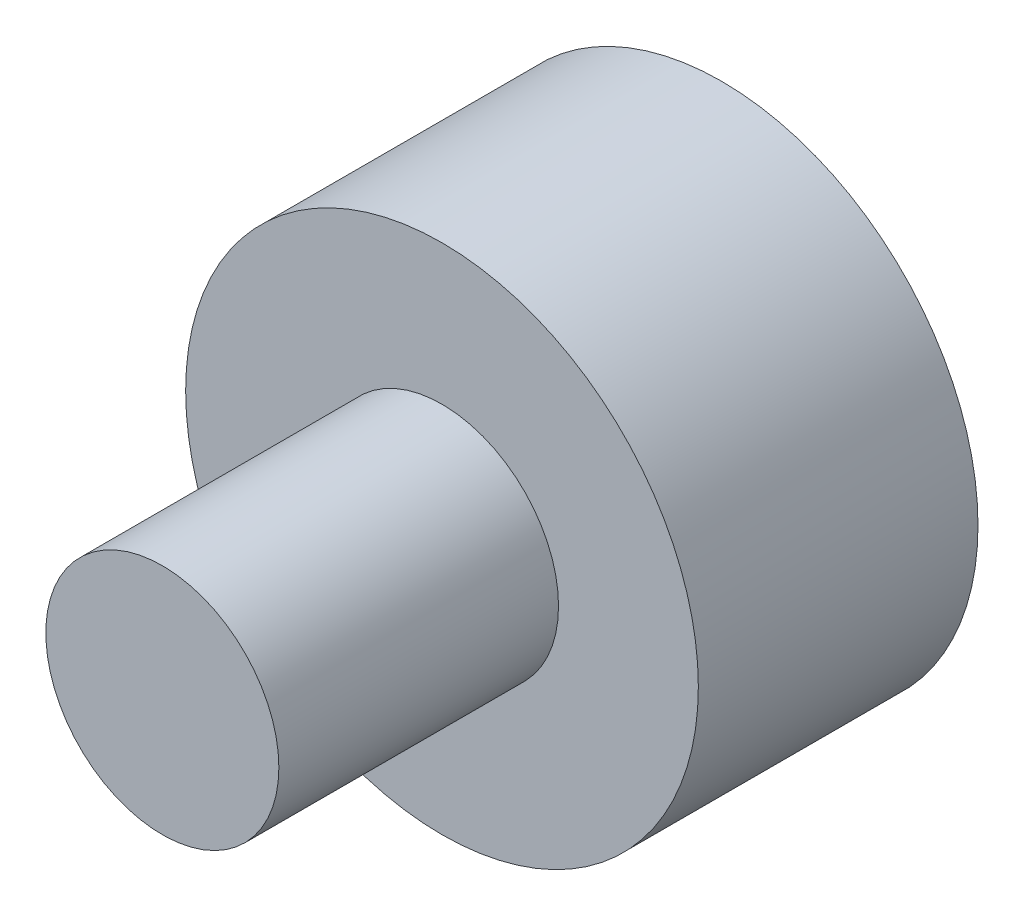
ISO-10303-21;
HEADER;
FILE_DESCRIPTION(('STEP AP214'),'2;1');
FILE_NAME('part.step','',(''),(''),'','','');
FILE_SCHEMA(('AUTOMOTIVE_DESIGN { 1 0 10303 214 1 1 1 1 }'));
ENDSEC;
DATA;
#1=APPLICATION_CONTEXT('core data for automotive mechanical design processes');
#2=APPLICATION_PROTOCOL_DEFINITION('international standard','automotive_design',2000,#1);
#3=PRODUCT_CONTEXT('',#1,'mechanical');
#4=PRODUCT('Part','Part','',(#3));
#5=PRODUCT_RELATED_PRODUCT_CATEGORY('part','',(#4));
#6=PRODUCT_DEFINITION_FORMATION('','',#4);
#7=PRODUCT_DEFINITION_CONTEXT('part definition',#1,'design');
#8=PRODUCT_DEFINITION('design','',#6,#7);
#9=PRODUCT_DEFINITION_SHAPE('','',#8);
#10=(LENGTH_UNIT() NAMED_UNIT(*) SI_UNIT(.MILLI.,.METRE.));
#11=(NAMED_UNIT(*) PLANE_ANGLE_UNIT() SI_UNIT($,.RADIAN.));
#12=(NAMED_UNIT(*) SI_UNIT($,.STERADIAN.) SOLID_ANGLE_UNIT());
#13=UNCERTAINTY_MEASURE_WITH_UNIT(LENGTH_MEASURE(1.E-05),#10,'distance_accuracy_value','');
#14=(GEOMETRIC_REPRESENTATION_CONTEXT(3) GLOBAL_UNCERTAINTY_ASSIGNED_CONTEXT((#13)) GLOBAL_UNIT_ASSIGNED_CONTEXT((#10,
#11,#12)) REPRESENTATION_CONTEXT('',''));
#15=CARTESIAN_POINT('',(0.,0.,0.));
#16=DIRECTION('',(0.,0.,1.));
#17=DIRECTION('',(1.,0.,0.));
#18=AXIS2_PLACEMENT_3D('',#15,#16,#17);
#19=CARTESIAN_POINT('',(0.,0.,3.));
#20=DIRECTION('',(0.,0.,-1.));
#21=DIRECTION('',(-1.,0.,0.));
#22=AXIS2_PLACEMENT_3D('',#19,#20,#21);
#23=CYLINDRICAL_SURFACE('',#22,2.75);
#24=CARTESIAN_POINT('',(0.,0.,3.));
#25=DIRECTION('',(0.,0.,1.));
#26=DIRECTION('',(1.,0.,0.));
#27=AXIS2_PLACEMENT_3D('',#24,#25,#26);
#28=CIRCLE('',#27,2.75);
#29=CARTESIAN_POINT('',(2.75,0.,3.));
#30=VERTEX_POINT('',#29);
#31=EDGE_CURVE('E51',#30,#30,#28,.T.);
#32=ORIENTED_EDGE('',*,*,#31,.F.);
#33=EDGE_LOOP('',(#32));
#34=FACE_BOUND('',#33,.T.);
#35=CARTESIAN_POINT('',(0.,0.,0.));
#36=DIRECTION('',(0.,0.,1.));
#37=DIRECTION('',(1.,0.,0.));
#38=AXIS2_PLACEMENT_3D('',#35,#36,#37);
#39=CIRCLE('',#38,2.75);
#40=CARTESIAN_POINT('',(2.75,0.,0.));
#41=VERTEX_POINT('',#40);
#42=EDGE_CURVE('E46',#41,#41,#39,.T.);
#43=ORIENTED_EDGE('',*,*,#42,.T.);
#44=EDGE_LOOP('',(#43));
#45=FACE_BOUND('',#44,.T.);
#46=ADVANCED_FACE('F43',(#34,#45),#23,.T.);
#47=CARTESIAN_POINT('',(0.,0.,3.));
#48=DIRECTION('',(0.,0.,1.));
#49=DIRECTION('',(1.,0.,0.));
#50=AXIS2_PLACEMENT_3D('',#47,#48,#49);
#51=PLANE('',#50);
#52=CARTESIAN_POINT('',(0.,0.,3.));
#53=DIRECTION('',(0.,0.,1.));
#54=DIRECTION('',(1.,0.,0.));
#55=AXIS2_PLACEMENT_3D('',#52,#53,#54);
#56=CIRCLE('',#55,1.25);
#57=CARTESIAN_POINT('',(1.25,0.,3.));
#58=VERTEX_POINT('',#57);
#59=EDGE_CURVE('E10',#58,#58,#56,.T.);
#60=ORIENTED_EDGE('',*,*,#59,.F.);
#61=EDGE_LOOP('',(#60));
#62=FACE_BOUND('',#61,.T.);
#63=ORIENTED_EDGE('',*,*,#31,.T.);
#64=EDGE_LOOP('',(#63));
#65=FACE_BOUND('',#64,.T.);
#66=ADVANCED_FACE('F71',(#62,#65),#51,.T.);
#67=CARTESIAN_POINT('',(0.,0.,0.));
#68=DIRECTION('',(0.,0.,1.));
#69=DIRECTION('',(1.,0.,0.));
#70=AXIS2_PLACEMENT_3D('',#67,#68,#69);
#71=PLANE('',#70);
#72=ORIENTED_EDGE('',*,*,#42,.F.);
#73=EDGE_LOOP('',(#72));
#74=FACE_BOUND('',#73,.T.);
#75=ADVANCED_FACE('F68',(#74),#71,.F.);
#76=CARTESIAN_POINT('',(0.,0.,6.));
#77=DIRECTION('',(0.,0.,-1.));
#78=DIRECTION('',(-1.,0.,0.));
#79=AXIS2_PLACEMENT_3D('',#76,#77,#78);
#80=CYLINDRICAL_SURFACE('',#79,1.25);
#81=CARTESIAN_POINT('',(0.,0.,6.));
#82=DIRECTION('',(0.,0.,1.));
#83=DIRECTION('',(1.,0.,0.));
#84=AXIS2_PLACEMENT_3D('',#81,#82,#83);
#85=CIRCLE('',#84,1.25);
#86=CARTESIAN_POINT('',(1.25,0.,6.));
#87=VERTEX_POINT('',#86);
#88=EDGE_CURVE('E58',#87,#87,#85,.T.);
#89=ORIENTED_EDGE('',*,*,#88,.F.);
#90=EDGE_LOOP('',(#89));
#91=FACE_BOUND('',#90,.T.);
#92=ORIENTED_EDGE('',*,*,#59,.T.);
#93=EDGE_LOOP('',(#92));
#94=FACE_BOUND('',#93,.T.);
#95=ADVANCED_FACE('F70',(#91,#94),#80,.T.);
#96=CARTESIAN_POINT('',(0.,0.,6.));
#97=DIRECTION('',(0.,0.,1.));
#98=DIRECTION('',(1.,0.,0.));
#99=AXIS2_PLACEMENT_3D('',#96,#97,#98);
#100=PLANE('',#99);
#101=ORIENTED_EDGE('',*,*,#88,.T.);
#102=EDGE_LOOP('',(#101));
#103=FACE_BOUND('',#102,.T.);
#104=ADVANCED_FACE('F77',(#103),#100,.T.);
#105=CLOSED_SHELL('',(#46,#66,#75,#95,#104));
#106=MANIFOLD_SOLID_BREP('B2',#105);
#107=ADVANCED_BREP_SHAPE_REPRESENTATION('',(#18,#106),#14);
#108=SHAPE_DEFINITION_REPRESENTATION(#9,#107);
ENDSEC;
END-ISO-10303-21;
